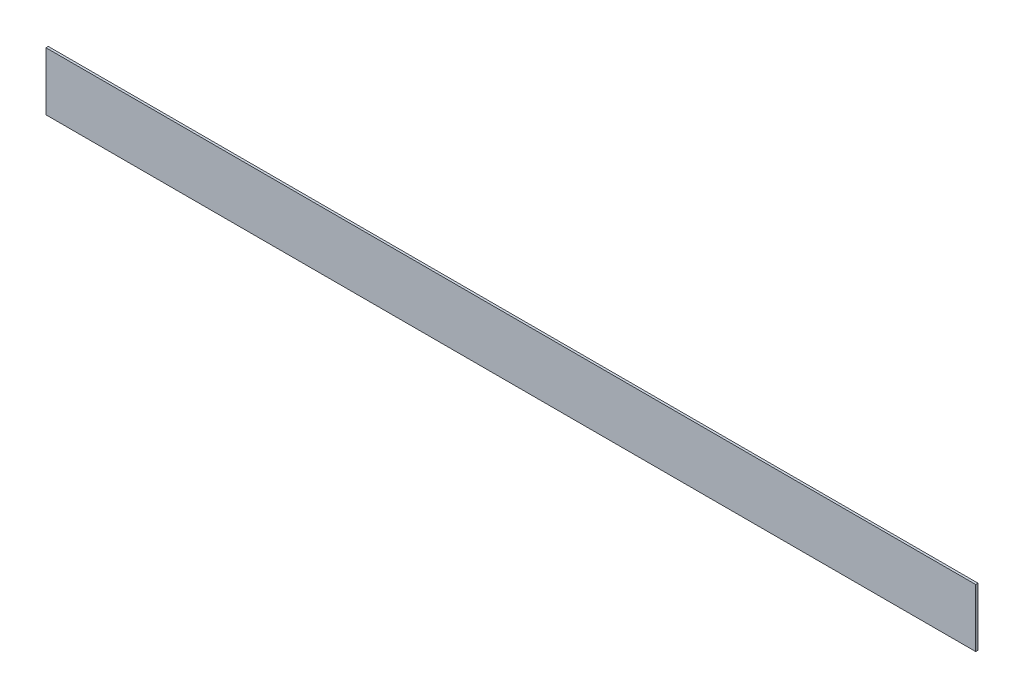
ISO-10303-21;
HEADER;
FILE_DESCRIPTION(('STEP AP214'),'2;1');
FILE_NAME('part.step','',(''),(''),'','','');
FILE_SCHEMA(('AUTOMOTIVE_DESIGN { 1 0 10303 214 1 1 1 1 }'));
ENDSEC;
DATA;
#1=APPLICATION_CONTEXT('core data for automotive mechanical design processes');
#2=APPLICATION_PROTOCOL_DEFINITION('international standard','automotive_design',2000,#1);
#3=PRODUCT_CONTEXT('',#1,'mechanical');
#4=PRODUCT('Part','Part','',(#3));
#5=PRODUCT_RELATED_PRODUCT_CATEGORY('part','',(#4));
#6=PRODUCT_DEFINITION_FORMATION('','',#4);
#7=PRODUCT_DEFINITION_CONTEXT('part definition',#1,'design');
#8=PRODUCT_DEFINITION('design','',#6,#7);
#9=PRODUCT_DEFINITION_SHAPE('','',#8);
#10=(LENGTH_UNIT() NAMED_UNIT(*) SI_UNIT(.MILLI.,.METRE.));
#11=(NAMED_UNIT(*) PLANE_ANGLE_UNIT() SI_UNIT($,.RADIAN.));
#12=(NAMED_UNIT(*) SI_UNIT($,.STERADIAN.) SOLID_ANGLE_UNIT());
#13=UNCERTAINTY_MEASURE_WITH_UNIT(LENGTH_MEASURE(1.E-05),#10,'distance_accuracy_value','');
#14=(GEOMETRIC_REPRESENTATION_CONTEXT(3) GLOBAL_UNCERTAINTY_ASSIGNED_CONTEXT((#13)) GLOBAL_UNIT_ASSIGNED_CONTEXT((#10,
#11,#12)) REPRESENTATION_CONTEXT('',''));
#15=CARTESIAN_POINT('',(0.,0.,0.));
#16=DIRECTION('',(0.,0.,1.));
#17=DIRECTION('',(1.,0.,0.));
#18=AXIS2_PLACEMENT_3D('',#15,#16,#17);
#19=CARTESIAN_POINT('',(-400.,-1745.,2.));
#20=DIRECTION('',(0.,1.,0.));
#21=DIRECTION('',(0.,0.,1.));
#22=AXIS2_PLACEMENT_3D('',#19,#20,#21);
#23=PLANE('',#22);
#24=DIRECTION('',(1.,0.,0.));
#25=VECTOR('',#24,1.);
#26=CARTESIAN_POINT('',(-400.,-1745.,0.));
#27=LINE('',#26,#25);
#28=CARTESIAN_POINT('',(-400.,-1745.,0.));
#29=VERTEX_POINT('',#28);
#30=CARTESIAN_POINT('',(400.,-1745.,0.));
#31=VERTEX_POINT('',#30);
#32=EDGE_CURVE('E96',#29,#31,#27,.T.);
#33=ORIENTED_EDGE('',*,*,#32,.T.);
#34=DIRECTION('',(0.,0.,-1.));
#35=VECTOR('',#34,1.);
#36=CARTESIAN_POINT('',(400.,-1745.,2.));
#37=LINE('',#36,#35);
#38=CARTESIAN_POINT('',(400.,-1745.,2.));
#39=VERTEX_POINT('',#38);
#40=EDGE_CURVE('E11',#39,#31,#37,.T.);
#41=ORIENTED_EDGE('',*,*,#40,.F.);
#42=DIRECTION('',(1.,0.,0.));
#43=VECTOR('',#42,1.);
#44=CARTESIAN_POINT('',(-400.,-1745.,2.));
#45=LINE('',#44,#43);
#46=CARTESIAN_POINT('',(-400.,-1745.,2.));
#47=VERTEX_POINT('',#46);
#48=EDGE_CURVE('E84',#47,#39,#45,.T.);
#49=ORIENTED_EDGE('',*,*,#48,.F.);
#50=DIRECTION('',(0.,0.,-1.));
#51=VECTOR('',#50,1.);
#52=CARTESIAN_POINT('',(-400.,-1745.,2.));
#53=LINE('',#52,#51);
#54=EDGE_CURVE('E92',#47,#29,#53,.T.);
#55=ORIENTED_EDGE('',*,*,#54,.T.);
#56=EDGE_LOOP('',(#33,#41,#49,#55));
#57=FACE_BOUND('',#56,.T.);
#58=ADVANCED_FACE('F33',(#57),#23,.F.);
#59=CARTESIAN_POINT('',(400.,-1745.,2.));
#60=DIRECTION('',(-1.,0.,0.));
#61=DIRECTION('',(0.,0.,1.));
#62=AXIS2_PLACEMENT_3D('',#59,#60,#61);
#63=PLANE('',#62);
#64=DIRECTION('',(0.,1.,0.));
#65=VECTOR('',#64,1.);
#66=CARTESIAN_POINT('',(400.,-1745.,0.));
#67=LINE('',#66,#65);
#68=CARTESIAN_POINT('',(400.,-1695.,0.));
#69=VERTEX_POINT('',#68);
#70=EDGE_CURVE('E88',#31,#69,#67,.T.);
#71=ORIENTED_EDGE('',*,*,#70,.T.);
#72=DIRECTION('',(0.,0.,-1.));
#73=VECTOR('',#72,1.);
#74=CARTESIAN_POINT('',(400.,-1695.,2.));
#75=LINE('',#74,#73);
#76=CARTESIAN_POINT('',(400.,-1695.,2.));
#77=VERTEX_POINT('',#76);
#78=EDGE_CURVE('E41',#77,#69,#75,.T.);
#79=ORIENTED_EDGE('',*,*,#78,.F.);
#80=DIRECTION('',(0.,1.,0.));
#81=VECTOR('',#80,1.);
#82=CARTESIAN_POINT('',(400.,-1745.,2.));
#83=LINE('',#82,#81);
#84=EDGE_CURVE('E79',#39,#77,#83,.T.);
#85=ORIENTED_EDGE('',*,*,#84,.F.);
#86=ORIENTED_EDGE('',*,*,#40,.T.);
#87=EDGE_LOOP('',(#71,#79,#85,#86));
#88=FACE_BOUND('',#87,.T.);
#89=ADVANCED_FACE('F87',(#88),#63,.F.);
#90=CARTESIAN_POINT('',(400.,-1695.,2.));
#91=DIRECTION('',(0.,-1.,0.));
#92=DIRECTION('',(1.,0.,0.));
#93=AXIS2_PLACEMENT_3D('',#90,#91,#92);
#94=PLANE('',#93);
#95=DIRECTION('',(-1.,0.,0.));
#96=VECTOR('',#95,1.);
#97=CARTESIAN_POINT('',(400.,-1695.,0.));
#98=LINE('',#97,#96);
#99=CARTESIAN_POINT('',(-400.,-1695.,0.));
#100=VERTEX_POINT('',#99);
#101=EDGE_CURVE('E66',#69,#100,#98,.T.);
#102=ORIENTED_EDGE('',*,*,#101,.T.);
#103=DIRECTION('',(0.,0.,-1.));
#104=VECTOR('',#103,1.);
#105=CARTESIAN_POINT('',(-400.,-1695.,2.));
#106=LINE('',#105,#104);
#107=CARTESIAN_POINT('',(-400.,-1695.,2.));
#108=VERTEX_POINT('',#107);
#109=EDGE_CURVE('E89',#108,#100,#106,.T.);
#110=ORIENTED_EDGE('',*,*,#109,.F.);
#111=DIRECTION('',(-1.,0.,0.));
#112=VECTOR('',#111,1.);
#113=CARTESIAN_POINT('',(400.,-1695.,2.));
#114=LINE('',#113,#112);
#115=EDGE_CURVE('E82',#77,#108,#114,.T.);
#116=ORIENTED_EDGE('',*,*,#115,.F.);
#117=ORIENTED_EDGE('',*,*,#78,.T.);
#118=EDGE_LOOP('',(#102,#110,#116,#117));
#119=FACE_BOUND('',#118,.T.);
#120=ADVANCED_FACE('F90',(#119),#94,.F.);
#121=CARTESIAN_POINT('',(-400.,-1695.,2.));
#122=DIRECTION('',(1.,0.,0.));
#123=DIRECTION('',(0.,0.,-1.));
#124=AXIS2_PLACEMENT_3D('',#121,#122,#123);
#125=PLANE('',#124);
#126=DIRECTION('',(0.,-1.,0.));
#127=VECTOR('',#126,1.);
#128=CARTESIAN_POINT('',(-400.,-1695.,0.));
#129=LINE('',#128,#127);
#130=EDGE_CURVE('E72',#100,#29,#129,.T.);
#131=ORIENTED_EDGE('',*,*,#130,.T.);
#132=ORIENTED_EDGE('',*,*,#54,.F.);
#133=DIRECTION('',(0.,-1.,0.));
#134=VECTOR('',#133,1.);
#135=CARTESIAN_POINT('',(-400.,-1695.,2.));
#136=LINE('',#135,#134);
#137=EDGE_CURVE('E49',#108,#47,#136,.T.);
#138=ORIENTED_EDGE('',*,*,#137,.F.);
#139=ORIENTED_EDGE('',*,*,#109,.T.);
#140=EDGE_LOOP('',(#131,#132,#138,#139));
#141=FACE_BOUND('',#140,.T.);
#142=ADVANCED_FACE('F103',(#141),#125,.F.);
#143=CARTESIAN_POINT('',(0.,0.,2.));
#144=DIRECTION('',(0.,0.,1.));
#145=DIRECTION('',(1.,0.,0.));
#146=AXIS2_PLACEMENT_3D('',#143,#144,#145);
#147=PLANE('',#146);
#148=ORIENTED_EDGE('',*,*,#48,.T.);
#149=ORIENTED_EDGE('',*,*,#84,.T.);
#150=ORIENTED_EDGE('',*,*,#115,.T.);
#151=ORIENTED_EDGE('',*,*,#137,.T.);
#152=EDGE_LOOP('',(#148,#149,#150,#151));
#153=FACE_BOUND('',#152,.T.);
#154=ADVANCED_FACE('F80',(#153),#147,.T.);
#155=CARTESIAN_POINT('',(0.,0.,0.));
#156=DIRECTION('',(0.,0.,1.));
#157=DIRECTION('',(1.,0.,0.));
#158=AXIS2_PLACEMENT_3D('',#155,#156,#157);
#159=PLANE('',#158);
#160=ORIENTED_EDGE('',*,*,#32,.F.);
#161=ORIENTED_EDGE('',*,*,#130,.F.);
#162=ORIENTED_EDGE('',*,*,#101,.F.);
#163=ORIENTED_EDGE('',*,*,#70,.F.);
#164=EDGE_LOOP('',(#160,#161,#162,#163));
#165=FACE_BOUND('',#164,.T.);
#166=ADVANCED_FACE('F106',(#165),#159,.F.);
#167=CLOSED_SHELL('',(#58,#89,#120,#142,#154,#166));
#168=MANIFOLD_SOLID_BREP('B2',#167);
#169=ADVANCED_BREP_SHAPE_REPRESENTATION('',(#18,#168),#14);
#170=SHAPE_DEFINITION_REPRESENTATION(#9,#169);
ENDSEC;
END-ISO-10303-21;
